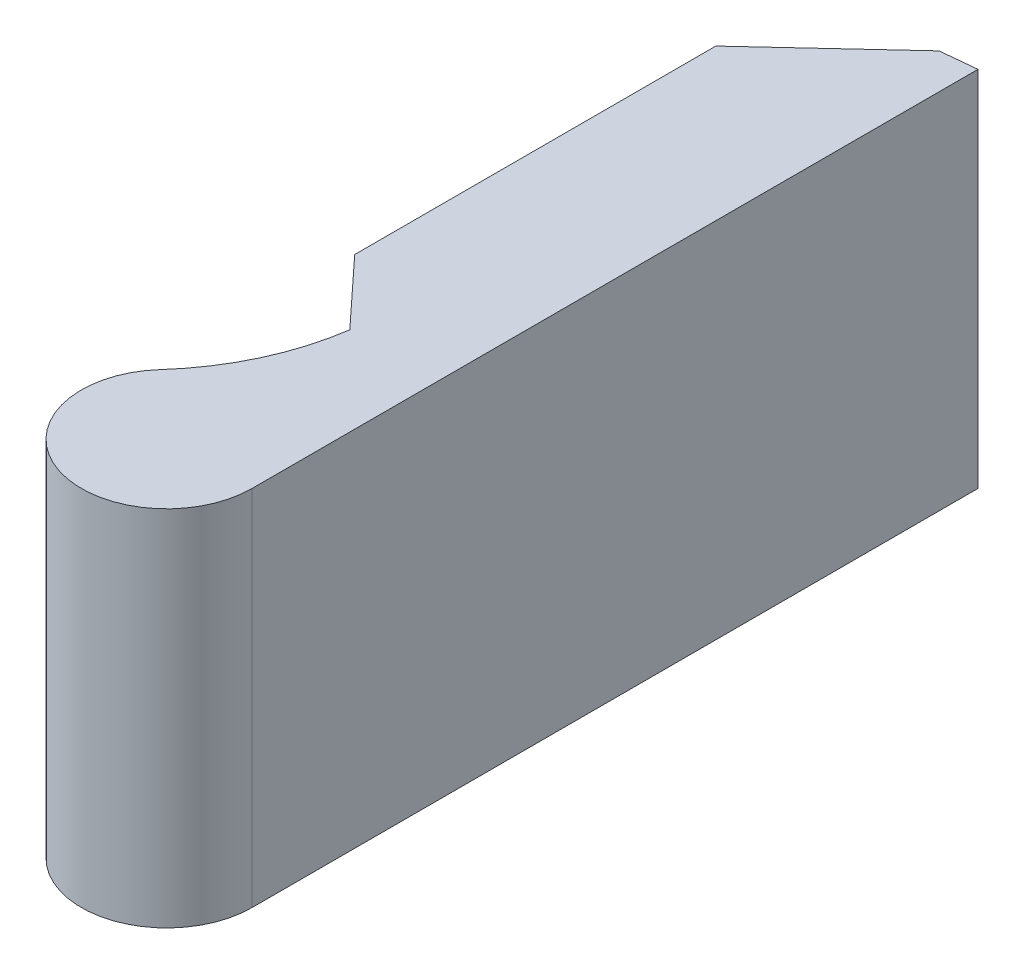
ISO-10303-21;
HEADER;
FILE_DESCRIPTION(('STEP AP214'),'2;1');
FILE_NAME('part.step','',(''),(''),'','','');
FILE_SCHEMA(('AUTOMOTIVE_DESIGN { 1 0 10303 214 1 1 1 1 }'));
ENDSEC;
DATA;
#1=APPLICATION_CONTEXT('core data for automotive mechanical design processes');
#2=APPLICATION_PROTOCOL_DEFINITION('international standard','automotive_design',2000,#1);
#3=PRODUCT_CONTEXT('',#1,'mechanical');
#4=PRODUCT('Part','Part','',(#3));
#5=PRODUCT_RELATED_PRODUCT_CATEGORY('part','',(#4));
#6=PRODUCT_DEFINITION_FORMATION('','',#4);
#7=PRODUCT_DEFINITION_CONTEXT('part definition',#1,'design');
#8=PRODUCT_DEFINITION('design','',#6,#7);
#9=PRODUCT_DEFINITION_SHAPE('','',#8);
#10=(LENGTH_UNIT() NAMED_UNIT(*) SI_UNIT(.MILLI.,.METRE.));
#11=(NAMED_UNIT(*) PLANE_ANGLE_UNIT() SI_UNIT($,.RADIAN.));
#12=(NAMED_UNIT(*) SI_UNIT($,.STERADIAN.) SOLID_ANGLE_UNIT());
#13=UNCERTAINTY_MEASURE_WITH_UNIT(LENGTH_MEASURE(1.E-05),#10,'distance_accuracy_value','');
#14=(GEOMETRIC_REPRESENTATION_CONTEXT(3) GLOBAL_UNCERTAINTY_ASSIGNED_CONTEXT((#13)) GLOBAL_UNIT_ASSIGNED_CONTEXT((#10,
#11,#12)) REPRESENTATION_CONTEXT('',''));
#15=CARTESIAN_POINT('',(0.,0.,0.));
#16=DIRECTION('',(0.,0.,1.));
#17=DIRECTION('',(1.,0.,0.));
#18=AXIS2_PLACEMENT_3D('',#15,#16,#17);
#19=CARTESIAN_POINT('',(-1.41076271773957,6.,3.53216714403988));
#20=DIRECTION('',(0.,-1.,0.));
#21=DIRECTION('',(0.,0.,-1.));
#22=AXIS2_PLACEMENT_3D('',#19,#20,#21);
#23=CYLINDRICAL_SURFACE('',#22,1.41076271773957);
#24=CARTESIAN_POINT('',(-1.41076271773957,0.,3.53216714403988));
#25=DIRECTION('',(0.,1.,0.));
#26=DIRECTION('',(0.,0.,-1.));
#27=AXIS2_PLACEMENT_3D('',#24,#25,#26);
#28=CIRCLE('',#27,1.41076271773957);
#29=CARTESIAN_POINT('',(-2.46058397710257,0.,2.58976236415311));
#30=VERTEX_POINT('',#29);
#31=CARTESIAN_POINT('',(0.,0.,3.53216714403988));
#32=VERTEX_POINT('',#31);
#33=EDGE_CURVE('E123',#30,#32,#28,.T.);
#34=ORIENTED_EDGE('',*,*,#33,.T.);
#35=DIRECTION('',(0.,-1.,0.));
#36=VECTOR('',#35,1.);
#37=CARTESIAN_POINT('',(0.,6.,3.53216714403988));
#38=LINE('',#37,#36);
#39=CARTESIAN_POINT('',(0.,6.,3.53216714403988));
#40=VERTEX_POINT('',#39);
#41=EDGE_CURVE('E11',#40,#32,#38,.T.);
#42=ORIENTED_EDGE('',*,*,#41,.F.);
#43=CARTESIAN_POINT('',(-1.41076271773957,6.,3.53216714403988));
#44=DIRECTION('',(0.,1.,0.));
#45=DIRECTION('',(0.,0.,-1.));
#46=AXIS2_PLACEMENT_3D('',#43,#44,#45);
#47=CIRCLE('',#46,1.41076271773957);
#48=CARTESIAN_POINT('',(-2.46058397710257,6.,2.58976236415311));
#49=VERTEX_POINT('',#48);
#50=EDGE_CURVE('E135',#49,#40,#47,.T.);
#51=ORIENTED_EDGE('',*,*,#50,.F.);
#52=DIRECTION('',(0.,-1.,0.));
#53=VECTOR('',#52,1.);
#54=CARTESIAN_POINT('',(-2.46058397710257,6.,2.58976236415311));
#55=LINE('',#54,#53);
#56=EDGE_CURVE('E119',#49,#30,#55,.T.);
#57=ORIENTED_EDGE('',*,*,#56,.T.);
#58=EDGE_LOOP('',(#34,#42,#51,#57));
#59=FACE_BOUND('',#58,.T.);
#60=ADVANCED_FACE('F33',(#59),#23,.T.);
#61=CARTESIAN_POINT('',(0.,6.,-8.46783285596012));
#62=DIRECTION('',(-1.,0.,0.));
#63=DIRECTION('',(0.,0.,1.));
#64=AXIS2_PLACEMENT_3D('',#61,#62,#63);
#65=PLANE('',#64);
#66=DIRECTION('',(0.,0.,-1.));
#67=VECTOR('',#66,1.);
#68=CARTESIAN_POINT('',(0.,0.,-8.46783285596012));
#69=LINE('',#68,#67);
#70=CARTESIAN_POINT('',(0.,0.,-8.46783285596012));
#71=VERTEX_POINT('',#70);
#72=EDGE_CURVE('E126',#32,#71,#69,.T.);
#73=ORIENTED_EDGE('',*,*,#72,.T.);
#74=DIRECTION('',(0.,-1.,0.));
#75=VECTOR('',#74,1.);
#76=CARTESIAN_POINT('',(0.,6.,-8.46783285596012));
#77=LINE('',#76,#75);
#78=CARTESIAN_POINT('',(0.,6.,-8.46783285596012));
#79=VERTEX_POINT('',#78);
#80=EDGE_CURVE('E41',#79,#71,#77,.T.);
#81=ORIENTED_EDGE('',*,*,#80,.F.);
#82=DIRECTION('',(0.,0.,-1.));
#83=VECTOR('',#82,1.);
#84=CARTESIAN_POINT('',(0.,6.,-8.46783285596012));
#85=LINE('',#84,#83);
#86=EDGE_CURVE('E89',#40,#79,#85,.T.);
#87=ORIENTED_EDGE('',*,*,#86,.F.);
#88=ORIENTED_EDGE('',*,*,#41,.T.);
#89=EDGE_LOOP('',(#73,#81,#87,#88));
#90=FACE_BOUND('',#89,.T.);
#91=ADVANCED_FACE('F160',(#90),#65,.F.);
#92=CARTESIAN_POINT('',(-0.586152098011663,6.,-8.40949324706445));
#93=DIRECTION('',(0.0990404657056847,0.,0.995083406631224));
#94=DIRECTION('',(0.995083406631224,0.,-0.0990404657056847));
#95=AXIS2_PLACEMENT_3D('',#92,#93,#94);
#96=PLANE('',#95);
#97=DIRECTION('',(-0.995083406631224,0.,0.0990404657056847));
#98=VECTOR('',#97,1.);
#99=CARTESIAN_POINT('',(-0.586152098011663,0.,-8.40949324706445));
#100=LINE('',#99,#98);
#101=CARTESIAN_POINT('',(-0.586152098011663,0.,-8.40949324706445));
#102=VERTEX_POINT('',#101);
#103=EDGE_CURVE('E128',#71,#102,#100,.T.);
#104=ORIENTED_EDGE('',*,*,#103,.T.);
#105=DIRECTION('',(0.,-1.,0.));
#106=VECTOR('',#105,1.);
#107=CARTESIAN_POINT('',(-0.586152098011663,6.,-8.40949324706445));
#108=LINE('',#107,#106);
#109=CARTESIAN_POINT('',(-0.586152098011663,6.,-8.40949324706445));
#110=VERTEX_POINT('',#109);
#111=EDGE_CURVE('E139',#110,#102,#108,.T.);
#112=ORIENTED_EDGE('',*,*,#111,.F.);
#113=DIRECTION('',(-0.995083406631224,0.,0.0990404657056847));
#114=VECTOR('',#113,1.);
#115=CARTESIAN_POINT('',(-0.586152098011663,6.,-8.40949324706445));
#116=LINE('',#115,#114);
#117=EDGE_CURVE('E147',#79,#110,#116,.T.);
#118=ORIENTED_EDGE('',*,*,#117,.F.);
#119=ORIENTED_EDGE('',*,*,#80,.T.);
#120=EDGE_LOOP('',(#104,#112,#118,#119));
#121=FACE_BOUND('',#120,.T.);
#122=ADVANCED_FACE('F145',(#121),#96,.F.);
#123=CARTESIAN_POINT('',(-2.5,6.,-6.63432997565499));
#124=DIRECTION('',(0.680043433848539,0.,0.73317182711796));
#125=DIRECTION('',(0.73317182711796,0.,-0.680043433848539));
#126=AXIS2_PLACEMENT_3D('',#123,#124,#125);
#127=PLANE('',#126);
#128=DIRECTION('',(-0.73317182711796,0.,0.680043433848539));
#129=VECTOR('',#128,1.);
#130=CARTESIAN_POINT('',(-2.5,0.,-6.63432997565499));
#131=LINE('',#130,#129);
#132=CARTESIAN_POINT('',(-2.5,0.,-6.63432997565499));
#133=VERTEX_POINT('',#132);
#134=EDGE_CURVE('E130',#102,#133,#131,.T.);
#135=ORIENTED_EDGE('',*,*,#134,.T.);
#136=DIRECTION('',(0.,-1.,0.));
#137=VECTOR('',#136,1.);
#138=CARTESIAN_POINT('',(-2.5,6.,-6.63432997565499));
#139=LINE('',#138,#137);
#140=CARTESIAN_POINT('',(-2.5,6.,-6.63432997565499));
#141=VERTEX_POINT('',#140);
#142=EDGE_CURVE('E114',#141,#133,#139,.T.);
#143=ORIENTED_EDGE('',*,*,#142,.F.);
#144=DIRECTION('',(-0.73317182711796,0.,0.680043433848539));
#145=VECTOR('',#144,1.);
#146=CARTESIAN_POINT('',(-2.5,6.,-6.63432997565499));
#147=LINE('',#146,#145);
#148=EDGE_CURVE('E105',#110,#141,#147,.T.);
#149=ORIENTED_EDGE('',*,*,#148,.F.);
#150=ORIENTED_EDGE('',*,*,#111,.T.);
#151=EDGE_LOOP('',(#135,#143,#149,#150));
#152=FACE_BOUND('',#151,.T.);
#153=ADVANCED_FACE('F153',(#152),#127,.F.);
#154=CARTESIAN_POINT('',(-2.5,6.,-0.66490865795103));
#155=DIRECTION('',(1.,0.,0.));
#156=DIRECTION('',(0.,0.,-1.));
#157=AXIS2_PLACEMENT_3D('',#154,#155,#156);
#158=PLANE('',#157);
#159=DIRECTION('',(0.,0.,1.));
#160=VECTOR('',#159,1.);
#161=CARTESIAN_POINT('',(-2.5,0.,-0.66490865795103));
#162=LINE('',#161,#160);
#163=CARTESIAN_POINT('',(-2.5,0.,-0.66490865795103));
#164=VERTEX_POINT('',#163);
#165=EDGE_CURVE('E113',#133,#164,#162,.T.);
#166=ORIENTED_EDGE('',*,*,#165,.T.);
#167=DIRECTION('',(0.,-1.,0.));
#168=VECTOR('',#167,1.);
#169=CARTESIAN_POINT('',(-2.5,6.,-0.66490865795103));
#170=LINE('',#169,#168);
#171=CARTESIAN_POINT('',(-2.5,6.,-0.66490865795103));
#172=VERTEX_POINT('',#171);
#173=EDGE_CURVE('E110',#172,#164,#170,.T.);
#174=ORIENTED_EDGE('',*,*,#173,.F.);
#175=DIRECTION('',(0.,0.,1.));
#176=VECTOR('',#175,1.);
#177=CARTESIAN_POINT('',(-2.5,6.,-0.66490865795103));
#178=LINE('',#177,#176);
#179=EDGE_CURVE('E99',#141,#172,#178,.T.);
#180=ORIENTED_EDGE('',*,*,#179,.F.);
#181=ORIENTED_EDGE('',*,*,#142,.T.);
#182=EDGE_LOOP('',(#166,#174,#180,#181));
#183=FACE_BOUND('',#182,.T.);
#184=ADVANCED_FACE('F111',(#183),#158,.F.);
#185=CARTESIAN_POINT('',(-1.46389885647979,6.,0.452137887406699));
#186=DIRECTION('',(0.733171827117959,0.,-0.680043433848539));
#187=DIRECTION('',(-0.680043433848539,0.,-0.733171827117959));
#188=AXIS2_PLACEMENT_3D('',#185,#186,#187);
#189=PLANE('',#188);
#190=DIRECTION('',(0.680043433848539,0.,0.733171827117959));
#191=VECTOR('',#190,1.);
#192=CARTESIAN_POINT('',(-1.46389885647979,0.,0.452137887406699));
#193=LINE('',#192,#191);
#194=CARTESIAN_POINT('',(-1.46389885647979,0.,0.452137887406699));
#195=VERTEX_POINT('',#194);
#196=EDGE_CURVE('E75',#164,#195,#193,.T.);
#197=ORIENTED_EDGE('',*,*,#196,.T.);
#198=DIRECTION('',(0.,-1.,0.));
#199=VECTOR('',#198,1.);
#200=CARTESIAN_POINT('',(-1.46389885647979,6.,0.452137887406699));
#201=LINE('',#200,#199);
#202=CARTESIAN_POINT('',(-1.46389885647979,6.,0.452137887406699));
#203=VERTEX_POINT('',#202);
#204=EDGE_CURVE('E115',#203,#195,#201,.T.);
#205=ORIENTED_EDGE('',*,*,#204,.F.);
#206=DIRECTION('',(0.680043433848539,0.,0.733171827117959));
#207=VECTOR('',#206,1.);
#208=CARTESIAN_POINT('',(-1.46389885647979,6.,0.452137887406699));
#209=LINE('',#208,#207);
#210=EDGE_CURVE('E103',#172,#203,#209,.T.);
#211=ORIENTED_EDGE('',*,*,#210,.F.);
#212=ORIENTED_EDGE('',*,*,#173,.T.);
#213=EDGE_LOOP('',(#197,#205,#211,#212));
#214=FACE_BOUND('',#213,.T.);
#215=ADVANCED_FACE('F117',(#214),#189,.F.);
#216=CARTESIAN_POINT('',(-5.47657737478329,6.,-0.117638127818134));
#217=DIRECTION('',(0.,-1.,0.));
#218=DIRECTION('',(0.,0.,-1.));
#219=AXIS2_PLACEMENT_3D('',#216,#217,#218);
#220=CYLINDRICAL_SURFACE('',#219,4.05292901477189);
#221=CARTESIAN_POINT('',(-5.47657737478329,0.,-0.117638127818134));
#222=DIRECTION('',(0.,-1.,0.));
#223=DIRECTION('',(0.,0.,1.));
#224=AXIS2_PLACEMENT_3D('',#221,#222,#223);
#225=CIRCLE('',#224,4.05292901477189);
#226=EDGE_CURVE('E81',#195,#30,#225,.T.);
#227=ORIENTED_EDGE('',*,*,#226,.T.);
#228=ORIENTED_EDGE('',*,*,#56,.F.);
#229=CARTESIAN_POINT('',(-5.47657737478329,6.,-0.117638127818134));
#230=DIRECTION('',(0.,-1.,0.));
#231=DIRECTION('',(0.,0.,1.));
#232=AXIS2_PLACEMENT_3D('',#229,#230,#231);
#233=CIRCLE('',#232,4.05292901477189);
#234=EDGE_CURVE('E49',#203,#49,#233,.T.);
#235=ORIENTED_EDGE('',*,*,#234,.F.);
#236=ORIENTED_EDGE('',*,*,#204,.T.);
#237=EDGE_LOOP('',(#227,#228,#235,#236));
#238=FACE_BOUND('',#237,.T.);
#239=ADVANCED_FACE('F174',(#238),#220,.F.);
#240=CARTESIAN_POINT('',(-1.41076271773957,6.,3.53216714403988));
#241=DIRECTION('',(0.,-1.,0.));
#242=DIRECTION('',(0.,0.,-1.));
#243=AXIS2_PLACEMENT_3D('',#240,#241,#242);
#244=PLANE('',#243);
#245=ORIENTED_EDGE('',*,*,#50,.T.);
#246=ORIENTED_EDGE('',*,*,#86,.T.);
#247=ORIENTED_EDGE('',*,*,#117,.T.);
#248=ORIENTED_EDGE('',*,*,#148,.T.);
#249=ORIENTED_EDGE('',*,*,#179,.T.);
#250=ORIENTED_EDGE('',*,*,#210,.T.);
#251=ORIENTED_EDGE('',*,*,#234,.T.);
#252=EDGE_LOOP('',(#245,#246,#247,#248,#249,#250,#251));
#253=FACE_BOUND('',#252,.T.);
#254=ADVANCED_FACE('F101',(#253),#244,.F.);
#255=CARTESIAN_POINT('',(-1.41076271773957,0.,3.53216714403988));
#256=DIRECTION('',(0.,-1.,0.));
#257=DIRECTION('',(0.,0.,-1.));
#258=AXIS2_PLACEMENT_3D('',#255,#256,#257);
#259=PLANE('',#258);
#260=ORIENTED_EDGE('',*,*,#33,.F.);
#261=ORIENTED_EDGE('',*,*,#226,.F.);
#262=ORIENTED_EDGE('',*,*,#196,.F.);
#263=ORIENTED_EDGE('',*,*,#165,.F.);
#264=ORIENTED_EDGE('',*,*,#134,.F.);
#265=ORIENTED_EDGE('',*,*,#103,.F.);
#266=ORIENTED_EDGE('',*,*,#72,.F.);
#267=EDGE_LOOP('',(#260,#261,#262,#263,#264,#265,#266));
#268=FACE_BOUND('',#267,.T.);
#269=ADVANCED_FACE('F151',(#268),#259,.T.);
#270=CLOSED_SHELL('',(#60,#91,#122,#153,#184,#215,#239,#254,#269));
#271=MANIFOLD_SOLID_BREP('B2',#270);
#272=ADVANCED_BREP_SHAPE_REPRESENTATION('',(#18,#271),#14);
#273=SHAPE_DEFINITION_REPRESENTATION(#9,#272);
ENDSEC;
END-ISO-10303-21;
